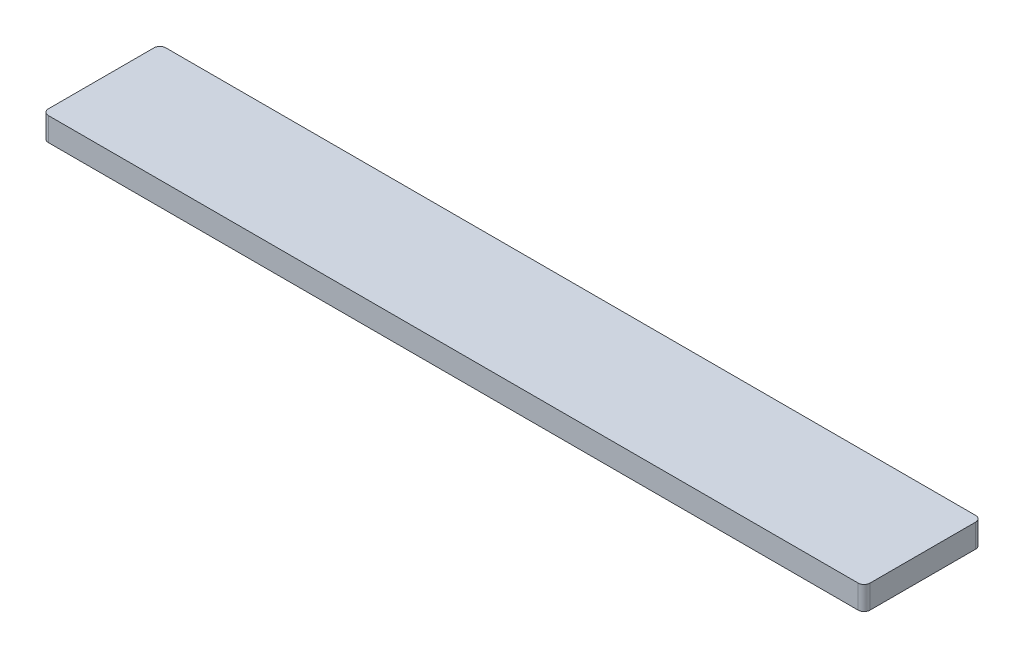
ISO-10303-21;
HEADER;
FILE_DESCRIPTION(('STEP AP214'),'2;1');
FILE_NAME('part.step','',(''),(''),'','','');
FILE_SCHEMA(('AUTOMOTIVE_DESIGN { 1 0 10303 214 1 1 1 1 }'));
ENDSEC;
DATA;
#1=APPLICATION_CONTEXT('core data for automotive mechanical design processes');
#2=APPLICATION_PROTOCOL_DEFINITION('international standard','automotive_design',2000,#1);
#3=PRODUCT_CONTEXT('',#1,'mechanical');
#4=PRODUCT('Part','Part','',(#3));
#5=PRODUCT_RELATED_PRODUCT_CATEGORY('part','',(#4));
#6=PRODUCT_DEFINITION_FORMATION('','',#4);
#7=PRODUCT_DEFINITION_CONTEXT('part definition',#1,'design');
#8=PRODUCT_DEFINITION('design','',#6,#7);
#9=PRODUCT_DEFINITION_SHAPE('','',#8);
#10=(LENGTH_UNIT() NAMED_UNIT(*) SI_UNIT(.MILLI.,.METRE.));
#11=(NAMED_UNIT(*) PLANE_ANGLE_UNIT() SI_UNIT($,.RADIAN.));
#12=(NAMED_UNIT(*) SI_UNIT($,.STERADIAN.) SOLID_ANGLE_UNIT());
#13=UNCERTAINTY_MEASURE_WITH_UNIT(LENGTH_MEASURE(1.E-05),#10,'distance_accuracy_value','');
#14=(GEOMETRIC_REPRESENTATION_CONTEXT(3) GLOBAL_UNCERTAINTY_ASSIGNED_CONTEXT((#13)) GLOBAL_UNIT_ASSIGNED_CONTEXT((#10,
#11,#12)) REPRESENTATION_CONTEXT('',''));
#15=CARTESIAN_POINT('',(0.,0.,0.));
#16=DIRECTION('',(0.,0.,1.));
#17=DIRECTION('',(1.,0.,0.));
#18=AXIS2_PLACEMENT_3D('',#15,#16,#17);
#19=CARTESIAN_POINT('',(0.,2.54,-12.7));
#20=DIRECTION('',(1.,0.,0.));
#21=DIRECTION('',(0.,0.,-1.));
#22=AXIS2_PLACEMENT_3D('',#19,#20,#21);
#23=PLANE('',#22);
#24=DIRECTION('',(0.,0.,1.));
#25=VECTOR('',#24,1.);
#26=CARTESIAN_POINT('',(0.,2.54,-12.7));
#27=LINE('',#26,#25);
#28=CARTESIAN_POINT('',(0.,2.54,-12.065));
#29=VERTEX_POINT('',#28);
#30=CARTESIAN_POINT('',(0.,2.54,-0.635));
#31=VERTEX_POINT('',#30);
#32=EDGE_CURVE('E173',#29,#31,#27,.T.);
#33=ORIENTED_EDGE('',*,*,#32,.F.);
#34=DIRECTION('',(0.,-1.,0.));
#35=VECTOR('',#34,1.);
#36=CARTESIAN_POINT('',(0.,2.54,-12.065));
#37=LINE('',#36,#35);
#38=CARTESIAN_POINT('',(0.,0.,-12.065));
#39=VERTEX_POINT('',#38);
#40=EDGE_CURVE('E198',#29,#39,#37,.T.);
#41=ORIENTED_EDGE('',*,*,#40,.T.);
#42=DIRECTION('',(0.,0.,1.));
#43=VECTOR('',#42,1.);
#44=CARTESIAN_POINT('',(0.,0.,-12.7));
#45=LINE('',#44,#43);
#46=CARTESIAN_POINT('',(0.,0.,-0.635));
#47=VERTEX_POINT('',#46);
#48=EDGE_CURVE('E186',#39,#47,#45,.T.);
#49=ORIENTED_EDGE('',*,*,#48,.T.);
#50=DIRECTION('',(0.,-1.,0.));
#51=VECTOR('',#50,1.);
#52=CARTESIAN_POINT('',(0.,2.54,-0.635));
#53=LINE('',#52,#51);
#54=EDGE_CURVE('E185',#47,#31,#53,.F.);
#55=ORIENTED_EDGE('',*,*,#54,.T.);
#56=EDGE_LOOP('',(#33,#41,#49,#55));
#57=FACE_BOUND('',#56,.T.);
#58=ADVANCED_FACE('F44',(#57),#23,.F.);
#59=CARTESIAN_POINT('',(0.,2.54,0.));
#60=DIRECTION('',(0.,0.,-1.));
#61=DIRECTION('',(-1.,0.,0.));
#62=AXIS2_PLACEMENT_3D('',#59,#60,#61);
#63=PLANE('',#62);
#64=DIRECTION('',(1.,0.,0.));
#65=VECTOR('',#64,1.);
#66=CARTESIAN_POINT('',(0.,0.,0.));
#67=LINE('',#66,#65);
#68=CARTESIAN_POINT('',(0.635,0.,0.));
#69=VERTEX_POINT('',#68);
#70=CARTESIAN_POINT('',(88.265,0.,0.));
#71=VERTEX_POINT('',#70);
#72=EDGE_CURVE('E189',#69,#71,#67,.T.);
#73=ORIENTED_EDGE('',*,*,#72,.T.);
#74=DIRECTION('',(0.,-1.,0.));
#75=VECTOR('',#74,1.);
#76=CARTESIAN_POINT('',(88.265,2.54,0.));
#77=LINE('',#76,#75);
#78=CARTESIAN_POINT('',(88.265,2.54,0.));
#79=VERTEX_POINT('',#78);
#80=EDGE_CURVE('E229',#71,#79,#77,.F.);
#81=ORIENTED_EDGE('',*,*,#80,.T.);
#82=DIRECTION('',(1.,0.,0.));
#83=VECTOR('',#82,1.);
#84=CARTESIAN_POINT('',(0.,2.54,0.));
#85=LINE('',#84,#83);
#86=CARTESIAN_POINT('',(0.635,2.54,0.));
#87=VERTEX_POINT('',#86);
#88=EDGE_CURVE('E176',#87,#79,#85,.T.);
#89=ORIENTED_EDGE('',*,*,#88,.F.);
#90=DIRECTION('',(0.,-1.,0.));
#91=VECTOR('',#90,1.);
#92=CARTESIAN_POINT('',(0.635,2.54,0.));
#93=LINE('',#92,#91);
#94=EDGE_CURVE('E226',#87,#69,#93,.T.);
#95=ORIENTED_EDGE('',*,*,#94,.T.);
#96=EDGE_LOOP('',(#73,#81,#89,#95));
#97=FACE_BOUND('',#96,.T.);
#98=ADVANCED_FACE('F250',(#97),#63,.F.);
#99=CARTESIAN_POINT('',(88.9,2.54,0.));
#100=DIRECTION('',(-1.,0.,0.));
#101=DIRECTION('',(0.,0.,1.));
#102=AXIS2_PLACEMENT_3D('',#99,#100,#101);
#103=PLANE('',#102);
#104=DIRECTION('',(0.,0.,-1.));
#105=VECTOR('',#104,1.);
#106=CARTESIAN_POINT('',(88.9,0.,0.));
#107=LINE('',#106,#105);
#108=CARTESIAN_POINT('',(88.9,0.,-0.635000000000001));
#109=VERTEX_POINT('',#108);
#110=CARTESIAN_POINT('',(88.9,0.,-12.065));
#111=VERTEX_POINT('',#110);
#112=EDGE_CURVE('E193',#109,#111,#107,.T.);
#113=ORIENTED_EDGE('',*,*,#112,.T.);
#114=DIRECTION('',(0.,-1.,0.));
#115=VECTOR('',#114,1.);
#116=CARTESIAN_POINT('',(88.9,2.54,-12.065));
#117=LINE('',#116,#115);
#118=CARTESIAN_POINT('',(88.9,2.54,-12.065));
#119=VERTEX_POINT('',#118);
#120=EDGE_CURVE('E67',#111,#119,#117,.F.);
#121=ORIENTED_EDGE('',*,*,#120,.T.);
#122=DIRECTION('',(0.,0.,-1.));
#123=VECTOR('',#122,1.);
#124=CARTESIAN_POINT('',(88.9,2.54,0.));
#125=LINE('',#124,#123);
#126=CARTESIAN_POINT('',(88.9,2.54,-0.635000000000001));
#127=VERTEX_POINT('',#126);
#128=EDGE_CURVE('E180',#127,#119,#125,.T.);
#129=ORIENTED_EDGE('',*,*,#128,.F.);
#130=DIRECTION('',(0.,-1.,0.));
#131=VECTOR('',#130,1.);
#132=CARTESIAN_POINT('',(88.9,2.54,-0.635000000000001));
#133=LINE('',#132,#131);
#134=EDGE_CURVE('E222',#127,#109,#133,.T.);
#135=ORIENTED_EDGE('',*,*,#134,.T.);
#136=EDGE_LOOP('',(#113,#121,#129,#135));
#137=FACE_BOUND('',#136,.T.);
#138=ADVANCED_FACE('F256',(#137),#103,.F.);
#139=CARTESIAN_POINT('',(88.9,2.54,-12.7));
#140=DIRECTION('',(0.,0.,1.));
#141=DIRECTION('',(1.,0.,0.));
#142=AXIS2_PLACEMENT_3D('',#139,#140,#141);
#143=PLANE('',#142);
#144=DIRECTION('',(-1.,0.,0.));
#145=VECTOR('',#144,1.);
#146=CARTESIAN_POINT('',(88.9,0.,-12.7));
#147=LINE('',#146,#145);
#148=CARTESIAN_POINT('',(88.265,0.,-12.7));
#149=VERTEX_POINT('',#148);
#150=CARTESIAN_POINT('',(0.634999999999997,0.,-12.7));
#151=VERTEX_POINT('',#150);
#152=EDGE_CURVE('E177',#149,#151,#147,.T.);
#153=ORIENTED_EDGE('',*,*,#152,.T.);
#154=DIRECTION('',(0.,-1.,0.));
#155=VECTOR('',#154,1.);
#156=CARTESIAN_POINT('',(0.634999999999997,2.54,-12.7));
#157=LINE('',#156,#155);
#158=CARTESIAN_POINT('',(0.634999999999997,2.54,-12.7));
#159=VERTEX_POINT('',#158);
#160=EDGE_CURVE('E212',#151,#159,#157,.F.);
#161=ORIENTED_EDGE('',*,*,#160,.T.);
#162=DIRECTION('',(-1.,0.,0.));
#163=VECTOR('',#162,1.);
#164=CARTESIAN_POINT('',(88.9,2.54,-12.7));
#165=LINE('',#164,#163);
#166=CARTESIAN_POINT('',(88.265,2.54,-12.7));
#167=VERTEX_POINT('',#166);
#168=EDGE_CURVE('E182',#167,#159,#165,.T.);
#169=ORIENTED_EDGE('',*,*,#168,.F.);
#170=DIRECTION('',(0.,-1.,0.));
#171=VECTOR('',#170,1.);
#172=CARTESIAN_POINT('',(88.265,2.54,-12.7));
#173=LINE('',#172,#171);
#174=EDGE_CURVE('E209',#167,#149,#173,.T.);
#175=ORIENTED_EDGE('',*,*,#174,.T.);
#176=EDGE_LOOP('',(#153,#161,#169,#175));
#177=FACE_BOUND('',#176,.T.);
#178=ADVANCED_FACE('F292',(#177),#143,.F.);
#179=CARTESIAN_POINT('',(0.,2.54,0.));
#180=DIRECTION('',(0.,1.,0.));
#181=DIRECTION('',(0.,0.,1.));
#182=AXIS2_PLACEMENT_3D('',#179,#180,#181);
#183=PLANE('',#182);
#184=ORIENTED_EDGE('',*,*,#168,.T.);
#185=CARTESIAN_POINT('',(0.634999999999995,2.54,-12.065));
#186=DIRECTION('',(0.,1.,0.));
#187=DIRECTION('',(0.,0.,1.));
#188=AXIS2_PLACEMENT_3D('',#185,#186,#187);
#189=CIRCLE('',#188,0.635);
#190=EDGE_CURVE('E220',#159,#29,#189,.T.);
#191=ORIENTED_EDGE('',*,*,#190,.T.);
#192=ORIENTED_EDGE('',*,*,#32,.T.);
#193=CARTESIAN_POINT('',(0.635,2.54,-0.635));
#194=DIRECTION('',(0.,1.,0.));
#195=DIRECTION('',(0.,0.,1.));
#196=AXIS2_PLACEMENT_3D('',#193,#194,#195);
#197=CIRCLE('',#196,0.635);
#198=EDGE_CURVE('E214',#31,#87,#197,.T.);
#199=ORIENTED_EDGE('',*,*,#198,.T.);
#200=ORIENTED_EDGE('',*,*,#88,.T.);
#201=CARTESIAN_POINT('',(88.265,2.54,-0.635));
#202=DIRECTION('',(0.,1.,0.));
#203=DIRECTION('',(0.,0.,1.));
#204=AXIS2_PLACEMENT_3D('',#201,#202,#203);
#205=CIRCLE('',#204,0.635);
#206=EDGE_CURVE('E216',#79,#127,#205,.T.);
#207=ORIENTED_EDGE('',*,*,#206,.T.);
#208=ORIENTED_EDGE('',*,*,#128,.T.);
#209=CARTESIAN_POINT('',(88.265,2.54,-12.065));
#210=DIRECTION('',(0.,1.,0.));
#211=DIRECTION('',(0.,0.,1.));
#212=AXIS2_PLACEMENT_3D('',#209,#210,#211);
#213=CIRCLE('',#212,0.635);
#214=EDGE_CURVE('E218',#119,#167,#213,.T.);
#215=ORIENTED_EDGE('',*,*,#214,.T.);
#216=EDGE_LOOP('',(#184,#191,#192,#199,#200,#207,#208,#215));
#217=FACE_BOUND('',#216,.T.);
#218=ADVANCED_FACE('F281',(#217),#183,.T.);
#219=CARTESIAN_POINT('',(0.,0.,0.));
#220=DIRECTION('',(0.,1.,0.));
#221=DIRECTION('',(0.,0.,1.));
#222=AXIS2_PLACEMENT_3D('',#219,#220,#221);
#223=PLANE('',#222);
#224=DIRECTION('',(-1.,0.,0.));
#225=VECTOR('',#224,1.);
#226=CARTESIAN_POINT('',(88.9,0.,-12.065));
#227=LINE('',#226,#225);
#228=CARTESIAN_POINT('',(88.265,0.,-12.065));
#229=VERTEX_POINT('',#228);
#230=CARTESIAN_POINT('',(0.634999999999995,0.,-12.065));
#231=VERTEX_POINT('',#230);
#232=EDGE_CURVE('E145',#229,#231,#227,.T.);
#233=ORIENTED_EDGE('',*,*,#232,.T.);
#234=DIRECTION('',(0.,0.,1.));
#235=VECTOR('',#234,1.);
#236=CARTESIAN_POINT('',(0.634999999999995,0.,-12.7));
#237=LINE('',#236,#235);
#238=CARTESIAN_POINT('',(0.635,0.,-0.635));
#239=VERTEX_POINT('',#238);
#240=EDGE_CURVE('E151',#231,#239,#237,.T.);
#241=ORIENTED_EDGE('',*,*,#240,.T.);
#242=DIRECTION('',(1.,0.,0.));
#243=VECTOR('',#242,1.);
#244=CARTESIAN_POINT('',(0.,0.,-0.635));
#245=LINE('',#244,#243);
#246=CARTESIAN_POINT('',(88.265,0.,-0.635));
#247=VERTEX_POINT('',#246);
#248=EDGE_CURVE('E167',#239,#247,#245,.T.);
#249=ORIENTED_EDGE('',*,*,#248,.T.);
#250=DIRECTION('',(0.,0.,-1.));
#251=VECTOR('',#250,1.);
#252=CARTESIAN_POINT('',(88.265,0.,0.));
#253=LINE('',#252,#251);
#254=EDGE_CURVE('E59',#247,#229,#253,.T.);
#255=ORIENTED_EDGE('',*,*,#254,.T.);
#256=EDGE_LOOP('',(#233,#241,#249,#255));
#257=FACE_BOUND('',#256,.T.);
#258=ORIENTED_EDGE('',*,*,#48,.F.);
#259=CARTESIAN_POINT('',(0.634999999999995,0.,-12.065));
#260=DIRECTION('',(0.,1.,0.));
#261=DIRECTION('',(0.,0.,1.));
#262=AXIS2_PLACEMENT_3D('',#259,#260,#261);
#263=CIRCLE('',#262,0.635);
#264=EDGE_CURVE('E207',#39,#151,#263,.F.);
#265=ORIENTED_EDGE('',*,*,#264,.T.);
#266=ORIENTED_EDGE('',*,*,#152,.F.);
#267=CARTESIAN_POINT('',(88.265,0.,-12.065));
#268=DIRECTION('',(0.,1.,0.));
#269=DIRECTION('',(0.,0.,1.));
#270=AXIS2_PLACEMENT_3D('',#267,#268,#269);
#271=CIRCLE('',#270,0.635);
#272=EDGE_CURVE('E205',#149,#111,#271,.F.);
#273=ORIENTED_EDGE('',*,*,#272,.T.);
#274=ORIENTED_EDGE('',*,*,#112,.F.);
#275=CARTESIAN_POINT('',(88.265,0.,-0.635));
#276=DIRECTION('',(0.,1.,0.));
#277=DIRECTION('',(0.,0.,1.));
#278=AXIS2_PLACEMENT_3D('',#275,#276,#277);
#279=CIRCLE('',#278,0.635);
#280=EDGE_CURVE('E203',#109,#71,#279,.F.);
#281=ORIENTED_EDGE('',*,*,#280,.T.);
#282=ORIENTED_EDGE('',*,*,#72,.F.);
#283=CARTESIAN_POINT('',(0.635,0.,-0.635));
#284=DIRECTION('',(0.,1.,0.));
#285=DIRECTION('',(0.,0.,1.));
#286=AXIS2_PLACEMENT_3D('',#283,#284,#285);
#287=CIRCLE('',#286,0.635);
#288=EDGE_CURVE('E201',#69,#47,#287,.F.);
#289=ORIENTED_EDGE('',*,*,#288,.T.);
#290=EDGE_LOOP('',(#258,#265,#266,#273,#274,#281,#282,#289));
#291=FACE_BOUND('',#290,.T.);
#292=ADVANCED_FACE('F266',(#257,#291),#223,.F.);
#293=CARTESIAN_POINT('',(0.634999999999995,2.54,-12.065));
#294=DIRECTION('',(0.,-1.,0.));
#295=DIRECTION('',(0.,0.,-1.));
#296=AXIS2_PLACEMENT_3D('',#293,#294,#295);
#297=CYLINDRICAL_SURFACE('',#296,0.635);
#298=ORIENTED_EDGE('',*,*,#190,.F.);
#299=ORIENTED_EDGE('',*,*,#160,.F.);
#300=ORIENTED_EDGE('',*,*,#264,.F.);
#301=ORIENTED_EDGE('',*,*,#40,.F.);
#302=EDGE_LOOP('',(#298,#299,#300,#301));
#303=FACE_BOUND('',#302,.T.);
#304=ADVANCED_FACE('F262',(#303),#297,.T.);
#305=CARTESIAN_POINT('',(88.265,2.54,-12.065));
#306=DIRECTION('',(0.,-1.,0.));
#307=DIRECTION('',(0.,0.,-1.));
#308=AXIS2_PLACEMENT_3D('',#305,#306,#307);
#309=CYLINDRICAL_SURFACE('',#308,0.635);
#310=ORIENTED_EDGE('',*,*,#214,.F.);
#311=ORIENTED_EDGE('',*,*,#120,.F.);
#312=ORIENTED_EDGE('',*,*,#272,.F.);
#313=ORIENTED_EDGE('',*,*,#174,.F.);
#314=EDGE_LOOP('',(#310,#311,#312,#313));
#315=FACE_BOUND('',#314,.T.);
#316=ADVANCED_FACE('F265',(#315),#309,.T.);
#317=CARTESIAN_POINT('',(88.265,2.54,-0.635));
#318=DIRECTION('',(0.,-1.,0.));
#319=DIRECTION('',(0.,0.,-1.));
#320=AXIS2_PLACEMENT_3D('',#317,#318,#319);
#321=CYLINDRICAL_SURFACE('',#320,0.635);
#322=ORIENTED_EDGE('',*,*,#206,.F.);
#323=ORIENTED_EDGE('',*,*,#80,.F.);
#324=ORIENTED_EDGE('',*,*,#280,.F.);
#325=ORIENTED_EDGE('',*,*,#134,.F.);
#326=EDGE_LOOP('',(#322,#323,#324,#325));
#327=FACE_BOUND('',#326,.T.);
#328=ADVANCED_FACE('F269',(#327),#321,.T.);
#329=CARTESIAN_POINT('',(0.635,2.54,-0.635));
#330=DIRECTION('',(0.,-1.,0.));
#331=DIRECTION('',(0.,0.,-1.));
#332=AXIS2_PLACEMENT_3D('',#329,#330,#331);
#333=CYLINDRICAL_SURFACE('',#332,0.635);
#334=ORIENTED_EDGE('',*,*,#198,.F.);
#335=ORIENTED_EDGE('',*,*,#54,.F.);
#336=ORIENTED_EDGE('',*,*,#288,.F.);
#337=ORIENTED_EDGE('',*,*,#94,.F.);
#338=EDGE_LOOP('',(#334,#335,#336,#337));
#339=FACE_BOUND('',#338,.T.);
#340=ADVANCED_FACE('F46',(#339),#333,.T.);
#341=CARTESIAN_POINT('',(0.634999999999995,2.54,-12.7));
#342=DIRECTION('',(1.,0.,0.));
#343=DIRECTION('',(0.,0.,-1.));
#344=AXIS2_PLACEMENT_3D('',#341,#342,#343);
#345=PLANE('',#344);
#346=DIRECTION('',(0.,0.,1.));
#347=VECTOR('',#346,1.);
#348=CARTESIAN_POINT('',(0.634999999999995,1.905,-12.7));
#349=LINE('',#348,#347);
#350=CARTESIAN_POINT('',(0.634999999999995,1.905,-12.065));
#351=VERTEX_POINT('',#350);
#352=CARTESIAN_POINT('',(0.635,1.905,-0.635));
#353=VERTEX_POINT('',#352);
#354=EDGE_CURVE('E135',#351,#353,#349,.T.);
#355=ORIENTED_EDGE('',*,*,#354,.T.);
#356=DIRECTION('',(0.,1.,0.));
#357=VECTOR('',#356,1.);
#358=CARTESIAN_POINT('',(0.635,2.54,-0.635));
#359=LINE('',#358,#357);
#360=EDGE_CURVE('E156',#239,#353,#359,.T.);
#361=ORIENTED_EDGE('',*,*,#360,.F.);
#362=ORIENTED_EDGE('',*,*,#240,.F.);
#363=DIRECTION('',(0.,1.,0.));
#364=VECTOR('',#363,1.);
#365=CARTESIAN_POINT('',(0.634999999999997,2.54,-12.065));
#366=LINE('',#365,#364);
#367=EDGE_CURVE('E148',#231,#351,#366,.T.);
#368=ORIENTED_EDGE('',*,*,#367,.T.);
#369=EDGE_LOOP('',(#355,#361,#362,#368));
#370=FACE_BOUND('',#369,.T.);
#371=ADVANCED_FACE('F149',(#370),#345,.T.);
#372=CARTESIAN_POINT('',(0.,2.54,-0.635));
#373=DIRECTION('',(0.,0.,-1.));
#374=DIRECTION('',(-1.,0.,0.));
#375=AXIS2_PLACEMENT_3D('',#372,#373,#374);
#376=PLANE('',#375);
#377=ORIENTED_EDGE('',*,*,#248,.F.);
#378=ORIENTED_EDGE('',*,*,#360,.T.);
#379=DIRECTION('',(1.,0.,0.));
#380=VECTOR('',#379,1.);
#381=CARTESIAN_POINT('',(0.,1.905,-0.635));
#382=LINE('',#381,#380);
#383=CARTESIAN_POINT('',(88.265,1.905,-0.635));
#384=VERTEX_POINT('',#383);
#385=EDGE_CURVE('E142',#353,#384,#382,.T.);
#386=ORIENTED_EDGE('',*,*,#385,.T.);
#387=DIRECTION('',(0.,1.,0.));
#388=VECTOR('',#387,1.);
#389=CARTESIAN_POINT('',(88.265,2.54,-0.635));
#390=LINE('',#389,#388);
#391=EDGE_CURVE('E190',#247,#384,#390,.T.);
#392=ORIENTED_EDGE('',*,*,#391,.F.);
#393=EDGE_LOOP('',(#377,#378,#386,#392));
#394=FACE_BOUND('',#393,.T.);
#395=ADVANCED_FACE('F312',(#394),#376,.T.);
#396=CARTESIAN_POINT('',(88.265,2.54,0.));
#397=DIRECTION('',(-1.,0.,0.));
#398=DIRECTION('',(0.,0.,1.));
#399=AXIS2_PLACEMENT_3D('',#396,#397,#398);
#400=PLANE('',#399);
#401=ORIENTED_EDGE('',*,*,#254,.F.);
#402=ORIENTED_EDGE('',*,*,#391,.T.);
#403=DIRECTION('',(0.,0.,-1.));
#404=VECTOR('',#403,1.);
#405=CARTESIAN_POINT('',(88.265,1.905,0.));
#406=LINE('',#405,#404);
#407=CARTESIAN_POINT('',(88.265,1.905,-12.065));
#408=VERTEX_POINT('',#407);
#409=EDGE_CURVE('E160',#384,#408,#406,.T.);
#410=ORIENTED_EDGE('',*,*,#409,.T.);
#411=DIRECTION('',(0.,1.,0.));
#412=VECTOR('',#411,1.);
#413=CARTESIAN_POINT('',(88.265,2.54,-12.065));
#414=LINE('',#413,#412);
#415=EDGE_CURVE('E155',#229,#408,#414,.T.);
#416=ORIENTED_EDGE('',*,*,#415,.F.);
#417=EDGE_LOOP('',(#401,#402,#410,#416));
#418=FACE_BOUND('',#417,.T.);
#419=ADVANCED_FACE('F245',(#418),#400,.T.);
#420=CARTESIAN_POINT('',(88.9,2.54,-12.065));
#421=DIRECTION('',(0.,0.,1.));
#422=DIRECTION('',(1.,0.,0.));
#423=AXIS2_PLACEMENT_3D('',#420,#421,#422);
#424=PLANE('',#423);
#425=ORIENTED_EDGE('',*,*,#232,.F.);
#426=ORIENTED_EDGE('',*,*,#415,.T.);
#427=DIRECTION('',(-1.,0.,0.));
#428=VECTOR('',#427,1.);
#429=CARTESIAN_POINT('',(88.9,1.905,-12.065));
#430=LINE('',#429,#428);
#431=EDGE_CURVE('E139',#408,#351,#430,.T.);
#432=ORIENTED_EDGE('',*,*,#431,.T.);
#433=ORIENTED_EDGE('',*,*,#367,.F.);
#434=EDGE_LOOP('',(#425,#426,#432,#433));
#435=FACE_BOUND('',#434,.T.);
#436=ADVANCED_FACE('F158',(#435),#424,.T.);
#437=CARTESIAN_POINT('',(0.,1.905,0.));
#438=DIRECTION('',(0.,1.,0.));
#439=DIRECTION('',(0.,0.,1.));
#440=AXIS2_PLACEMENT_3D('',#437,#438,#439);
#441=PLANE('',#440);
#442=CARTESIAN_POINT('',(19.05,1.905,-6.35));
#443=DIRECTION('',(0.,1.,0.));
#444=DIRECTION('',(0.,0.,1.));
#445=AXIS2_PLACEMENT_3D('',#442,#443,#444);
#446=CIRCLE('',#445,2.54);
#447=CARTESIAN_POINT('',(19.05,1.905,-3.81));
#448=VERTEX_POINT('',#447);
#449=EDGE_CURVE('E13',#448,#448,#446,.F.);
#450=ORIENTED_EDGE('',*,*,#449,.F.);
#451=EDGE_LOOP('',(#450));
#452=FACE_BOUND('',#451,.T.);
#453=CARTESIAN_POINT('',(69.85,1.905,-6.35));
#454=DIRECTION('',(0.,1.,0.));
#455=DIRECTION('',(0.,0.,1.));
#456=AXIS2_PLACEMENT_3D('',#453,#454,#455);
#457=CIRCLE('',#456,2.54);
#458=CARTESIAN_POINT('',(69.85,1.905,-3.81));
#459=VERTEX_POINT('',#458);
#460=EDGE_CURVE('E52',#459,#459,#457,.F.);
#461=ORIENTED_EDGE('',*,*,#460,.F.);
#462=EDGE_LOOP('',(#461));
#463=FACE_BOUND('',#462,.T.);
#464=ORIENTED_EDGE('',*,*,#431,.F.);
#465=ORIENTED_EDGE('',*,*,#409,.F.);
#466=ORIENTED_EDGE('',*,*,#385,.F.);
#467=ORIENTED_EDGE('',*,*,#354,.F.);
#468=EDGE_LOOP('',(#464,#465,#466,#467));
#469=FACE_BOUND('',#468,.T.);
#470=ADVANCED_FACE('F137',(#452,#463,#469),#441,.F.);
#471=CARTESIAN_POINT('',(69.85,-0.635,-6.35));
#472=DIRECTION('',(0.,1.,0.));
#473=DIRECTION('',(0.,0.,1.));
#474=AXIS2_PLACEMENT_3D('',#471,#472,#473);
#475=CYLINDRICAL_SURFACE('',#474,2.54);
#476=CARTESIAN_POINT('',(69.85,-0.635,-6.35));
#477=DIRECTION('',(0.,-1.,0.));
#478=DIRECTION('',(0.,0.,-1.));
#479=AXIS2_PLACEMENT_3D('',#476,#477,#478);
#480=CIRCLE('',#479,2.54);
#481=CARTESIAN_POINT('',(69.85,-0.635,-8.89));
#482=VERTEX_POINT('',#481);
#483=EDGE_CURVE('E168',#482,#482,#480,.T.);
#484=ORIENTED_EDGE('',*,*,#483,.F.);
#485=EDGE_LOOP('',(#484));
#486=FACE_BOUND('',#485,.T.);
#487=ORIENTED_EDGE('',*,*,#460,.T.);
#488=EDGE_LOOP('',(#487));
#489=FACE_BOUND('',#488,.T.);
#490=ADVANCED_FACE('F233',(#486,#489),#475,.T.);
#491=CARTESIAN_POINT('',(69.85,-0.635,-6.35));
#492=DIRECTION('',(0.,-1.,0.));
#493=DIRECTION('',(0.,0.,-1.));
#494=AXIS2_PLACEMENT_3D('',#491,#492,#493);
#495=PLANE('',#494);
#496=ORIENTED_EDGE('',*,*,#483,.T.);
#497=EDGE_LOOP('',(#496));
#498=FACE_BOUND('',#497,.T.);
#499=ADVANCED_FACE('F242',(#498),#495,.T.);
#500=CARTESIAN_POINT('',(19.05,-0.635,-6.35));
#501=DIRECTION('',(0.,1.,0.));
#502=DIRECTION('',(0.,0.,1.));
#503=AXIS2_PLACEMENT_3D('',#500,#501,#502);
#504=CYLINDRICAL_SURFACE('',#503,2.54);
#505=CARTESIAN_POINT('',(19.05,-0.635,-6.35));
#506=DIRECTION('',(0.,-1.,0.));
#507=DIRECTION('',(0.,0.,-1.));
#508=AXIS2_PLACEMENT_3D('',#505,#506,#507);
#509=CIRCLE('',#508,2.54);
#510=CARTESIAN_POINT('',(19.05,-0.635,-8.89));
#511=VERTEX_POINT('',#510);
#512=EDGE_CURVE('E318',#511,#511,#509,.T.);
#513=ORIENTED_EDGE('',*,*,#512,.F.);
#514=EDGE_LOOP('',(#513));
#515=FACE_BOUND('',#514,.T.);
#516=ORIENTED_EDGE('',*,*,#449,.T.);
#517=EDGE_LOOP('',(#516));
#518=FACE_BOUND('',#517,.T.);
#519=ADVANCED_FACE('F324',(#515,#518),#504,.T.);
#520=CARTESIAN_POINT('',(19.05,-0.635,-6.35));
#521=DIRECTION('',(0.,-1.,0.));
#522=DIRECTION('',(0.,0.,-1.));
#523=AXIS2_PLACEMENT_3D('',#520,#521,#522);
#524=PLANE('',#523);
#525=ORIENTED_EDGE('',*,*,#512,.T.);
#526=EDGE_LOOP('',(#525));
#527=FACE_BOUND('',#526,.T.);
#528=ADVANCED_FACE('F322',(#527),#524,.T.);
#529=CLOSED_SHELL('',(#58,#98,#138,#178,#218,#292,#304,#316,#328,#340,#371,#395,#419,#436,#470,
#490,#499,#519,#528));
#530=MANIFOLD_SOLID_BREP('B2',#529);
#531=ADVANCED_BREP_SHAPE_REPRESENTATION('',(#18,#530),#14);
#532=SHAPE_DEFINITION_REPRESENTATION(#9,#531);
ENDSEC;
END-ISO-10303-21;
